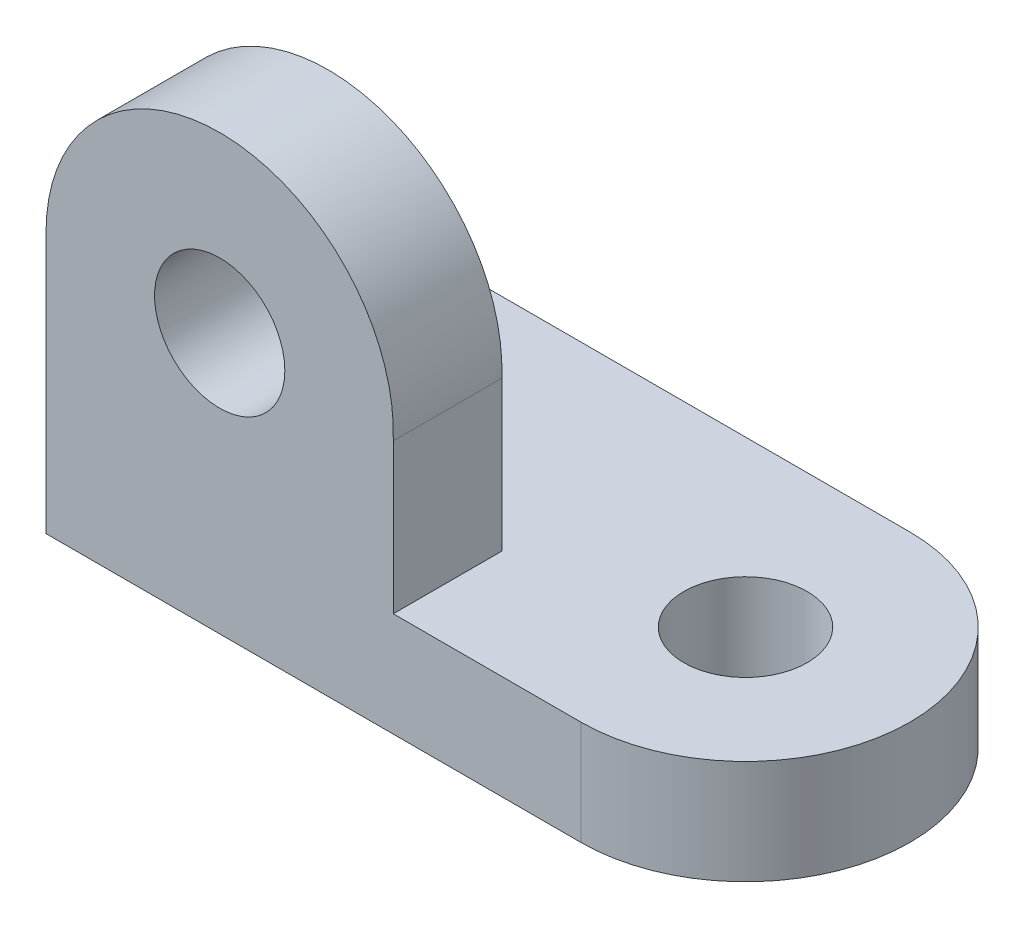
ISO-10303-21;
HEADER;
FILE_DESCRIPTION(('STEP AP214'),'2;1');
FILE_NAME('part.step','',(''),(''),'','','');
FILE_SCHEMA(('AUTOMOTIVE_DESIGN { 1 0 10303 214 1 1 1 1 }'));
ENDSEC;
DATA;
#1=APPLICATION_CONTEXT('core data for automotive mechanical design processes');
#2=APPLICATION_PROTOCOL_DEFINITION('international standard','automotive_design',2000,#1);
#3=PRODUCT_CONTEXT('',#1,'mechanical');
#4=PRODUCT('Part','Part','',(#3));
#5=PRODUCT_RELATED_PRODUCT_CATEGORY('part','',(#4));
#6=PRODUCT_DEFINITION_FORMATION('','',#4);
#7=PRODUCT_DEFINITION_CONTEXT('part definition',#1,'design');
#8=PRODUCT_DEFINITION('design','',#6,#7);
#9=PRODUCT_DEFINITION_SHAPE('','',#8);
#10=(LENGTH_UNIT() NAMED_UNIT(*) SI_UNIT(.MILLI.,.METRE.));
#11=(NAMED_UNIT(*) PLANE_ANGLE_UNIT() SI_UNIT($,.RADIAN.));
#12=(NAMED_UNIT(*) SI_UNIT($,.STERADIAN.) SOLID_ANGLE_UNIT());
#13=UNCERTAINTY_MEASURE_WITH_UNIT(LENGTH_MEASURE(1.E-05),#10,'distance_accuracy_value','');
#14=(GEOMETRIC_REPRESENTATION_CONTEXT(3) GLOBAL_UNCERTAINTY_ASSIGNED_CONTEXT((#13)) GLOBAL_UNIT_ASSIGNED_CONTEXT((#10,
#11,#12)) REPRESENTATION_CONTEXT('',''));
#15=CARTESIAN_POINT('',(0.,0.,0.));
#16=DIRECTION('',(0.,0.,1.));
#17=DIRECTION('',(1.,0.,0.));
#18=AXIS2_PLACEMENT_3D('',#15,#16,#17);
#19=CARTESIAN_POINT('',(123.179963090235,24.,-37.9015271046878));
#20=DIRECTION('',(0.,1.,0.));
#21=DIRECTION('',(0.,0.,1.));
#22=AXIS2_PLACEMENT_3D('',#19,#20,#21);
#23=PLANE('',#22);
#24=DIRECTION('',(-1.,0.,0.));
#25=VECTOR('',#24,1.);
#26=CARTESIAN_POINT('',(123.179963090235,24.,-75.8030542093757));
#27=LINE('',#26,#25);
#28=CARTESIAN_POINT('',(123.179963090235,24.,-75.8030542093757));
#29=VERTEX_POINT('',#28);
#30=CARTESIAN_POINT('',(20.,24.,-75.8030542093757));
#31=VERTEX_POINT('',#30);
#32=EDGE_CURVE('E159',#29,#31,#27,.T.);
#33=ORIENTED_EDGE('',*,*,#32,.T.);
#34=CARTESIAN_POINT('',(20.,24.,-55.8030542093757));
#35=DIRECTION('',(0.,1.,0.));
#36=DIRECTION('',(0.,0.,1.));
#37=AXIS2_PLACEMENT_3D('',#34,#35,#36);
#38=CIRCLE('',#37,20.);
#39=CARTESIAN_POINT('',(0.,24.,-55.8030542093757));
#40=VERTEX_POINT('',#39);
#41=EDGE_CURVE('E11',#31,#40,#38,.T.);
#42=ORIENTED_EDGE('',*,*,#41,.T.);
#43=DIRECTION('',(0.,0.,1.));
#44=VECTOR('',#43,1.);
#45=CARTESIAN_POINT('',(0.,24.,0.));
#46=LINE('',#45,#44);
#47=CARTESIAN_POINT('',(0.,24.,-25.));
#48=VERTEX_POINT('',#47);
#49=EDGE_CURVE('E161',#40,#48,#46,.T.);
#50=ORIENTED_EDGE('',*,*,#49,.T.);
#51=DIRECTION('',(-1.,0.,0.));
#52=VECTOR('',#51,1.);
#53=CARTESIAN_POINT('',(0.,24.,-25.));
#54=LINE('',#53,#52);
#55=CARTESIAN_POINT('',(79.9713533622832,24.,-25.));
#56=VERTEX_POINT('',#55);
#57=EDGE_CURVE('E112',#56,#48,#54,.T.);
#58=ORIENTED_EDGE('',*,*,#57,.F.);
#59=DIRECTION('',(0.,0.,1.));
#60=VECTOR('',#59,1.);
#61=CARTESIAN_POINT('',(79.9713533622832,24.,-25.));
#62=LINE('',#61,#60);
#63=CARTESIAN_POINT('',(79.9713533622832,24.,0.));
#64=VERTEX_POINT('',#63);
#65=EDGE_CURVE('E124',#56,#64,#62,.T.);
#66=ORIENTED_EDGE('',*,*,#65,.T.);
#67=DIRECTION('',(1.,0.,0.));
#68=VECTOR('',#67,1.);
#69=CARTESIAN_POINT('',(0.,24.,0.));
#70=LINE('',#69,#68);
#71=CARTESIAN_POINT('',(123.179963090235,24.,0.));
#72=VERTEX_POINT('',#71);
#73=EDGE_CURVE('E154',#64,#72,#70,.T.);
#74=ORIENTED_EDGE('',*,*,#73,.T.);
#75=CARTESIAN_POINT('',(123.179963090235,24.,-37.9015271046878));
#76=DIRECTION('',(0.,1.,0.));
#77=DIRECTION('',(0.,0.,1.));
#78=AXIS2_PLACEMENT_3D('',#75,#76,#77);
#79=CIRCLE('',#78,37.9015271046878);
#80=EDGE_CURVE('E156',#72,#29,#79,.T.);
#81=ORIENTED_EDGE('',*,*,#80,.T.);
#82=EDGE_LOOP('',(#33,#42,#50,#58,#66,#74,#81));
#83=FACE_BOUND('',#82,.T.);
#84=CARTESIAN_POINT('',(123.179963090235,24.,-37.9015271046878));
#85=DIRECTION('',(0.,1.,0.));
#86=DIRECTION('',(0.,0.,1.));
#87=AXIS2_PLACEMENT_3D('',#84,#85,#86);
#88=CIRCLE('',#87,14.213072664258);
#89=CARTESIAN_POINT('',(123.179963090235,24.,-23.6884544404299));
#90=VERTEX_POINT('',#89);
#91=EDGE_CURVE('E148',#90,#90,#88,.T.);
#92=ORIENTED_EDGE('',*,*,#91,.F.);
#93=EDGE_LOOP('',(#92));
#94=FACE_BOUND('',#93,.T.);
#95=ADVANCED_FACE('F39',(#83,#94),#23,.T.);
#96=CARTESIAN_POINT('',(123.179963090235,0.,-37.9015271046878));
#97=DIRECTION('',(0.,1.,0.));
#98=DIRECTION('',(0.,0.,1.));
#99=AXIS2_PLACEMENT_3D('',#96,#97,#98);
#100=PLANE('',#99);
#101=DIRECTION('',(0.,0.,1.));
#102=VECTOR('',#101,1.);
#103=CARTESIAN_POINT('',(0.,0.,0.));
#104=LINE('',#103,#102);
#105=CARTESIAN_POINT('',(0.,0.,-55.8030542093757));
#106=VERTEX_POINT('',#105);
#107=CARTESIAN_POINT('',(0.,0.,0.));
#108=VERTEX_POINT('',#107);
#109=EDGE_CURVE('E157',#106,#108,#104,.T.);
#110=ORIENTED_EDGE('',*,*,#109,.F.);
#111=CARTESIAN_POINT('',(20.,0.,-55.8030542093757));
#112=DIRECTION('',(0.,1.,0.));
#113=DIRECTION('',(0.,0.,1.));
#114=AXIS2_PLACEMENT_3D('',#111,#112,#113);
#115=CIRCLE('',#114,20.);
#116=CARTESIAN_POINT('',(20.,0.,-75.8030542093757));
#117=VERTEX_POINT('',#116);
#118=EDGE_CURVE('E61',#106,#117,#115,.F.);
#119=ORIENTED_EDGE('',*,*,#118,.T.);
#120=DIRECTION('',(-1.,0.,0.));
#121=VECTOR('',#120,1.);
#122=CARTESIAN_POINT('',(123.179963090235,0.,-75.8030542093757));
#123=LINE('',#122,#121);
#124=CARTESIAN_POINT('',(123.179963090235,0.,-75.8030542093757));
#125=VERTEX_POINT('',#124);
#126=EDGE_CURVE('E167',#125,#117,#123,.T.);
#127=ORIENTED_EDGE('',*,*,#126,.F.);
#128=CARTESIAN_POINT('',(123.179963090235,0.,-37.9015271046878));
#129=DIRECTION('',(0.,1.,0.));
#130=DIRECTION('',(0.,0.,1.));
#131=AXIS2_PLACEMENT_3D('',#128,#129,#130);
#132=CIRCLE('',#131,37.9015271046878);
#133=CARTESIAN_POINT('',(123.179963090235,0.,0.));
#134=VERTEX_POINT('',#133);
#135=EDGE_CURVE('E165',#134,#125,#132,.T.);
#136=ORIENTED_EDGE('',*,*,#135,.F.);
#137=DIRECTION('',(1.,0.,0.));
#138=VECTOR('',#137,1.);
#139=CARTESIAN_POINT('',(0.,0.,0.));
#140=LINE('',#139,#138);
#141=EDGE_CURVE('E151',#108,#134,#140,.T.);
#142=ORIENTED_EDGE('',*,*,#141,.F.);
#143=EDGE_LOOP('',(#110,#119,#127,#136,#142));
#144=FACE_BOUND('',#143,.T.);
#145=CARTESIAN_POINT('',(123.179963090235,0.,-37.9015271046878));
#146=DIRECTION('',(0.,1.,0.));
#147=DIRECTION('',(0.,0.,1.));
#148=AXIS2_PLACEMENT_3D('',#145,#146,#147);
#149=CIRCLE('',#148,14.213072664258);
#150=CARTESIAN_POINT('',(123.179963090235,0.,-23.6884544404299));
#151=VERTEX_POINT('',#150);
#152=EDGE_CURVE('E145',#151,#151,#149,.T.);
#153=ORIENTED_EDGE('',*,*,#152,.T.);
#154=EDGE_LOOP('',(#153));
#155=FACE_BOUND('',#154,.T.);
#156=ADVANCED_FACE('F184',(#144,#155),#100,.F.);
#157=CARTESIAN_POINT('',(0.,24.,0.));
#158=DIRECTION('',(0.,0.,-1.));
#159=DIRECTION('',(-1.,0.,0.));
#160=AXIS2_PLACEMENT_3D('',#157,#158,#159);
#161=PLANE('',#160);
#162=ORIENTED_EDGE('',*,*,#141,.T.);
#163=DIRECTION('',(0.,-1.,0.));
#164=VECTOR('',#163,1.);
#165=CARTESIAN_POINT('',(123.179963090235,24.,0.));
#166=LINE('',#165,#164);
#167=EDGE_CURVE('E174',#72,#134,#166,.T.);
#168=ORIENTED_EDGE('',*,*,#167,.F.);
#169=ORIENTED_EDGE('',*,*,#73,.F.);
#170=DIRECTION('',(0.,-1.,0.));
#171=VECTOR('',#170,1.);
#172=CARTESIAN_POINT('',(79.9713533622832,0.,0.));
#173=LINE('',#172,#171);
#174=CARTESIAN_POINT('',(79.9713533622832,58.4864246343528,0.));
#175=VERTEX_POINT('',#174);
#176=EDGE_CURVE('E133',#175,#64,#173,.T.);
#177=ORIENTED_EDGE('',*,*,#176,.F.);
#178=CARTESIAN_POINT('',(40.,60.,0.));
#179=DIRECTION('',(0.,0.,1.));
#180=DIRECTION('',(1.,0.,0.));
#181=AXIS2_PLACEMENT_3D('',#178,#179,#180);
#182=CIRCLE('',#181,40.);
#183=CARTESIAN_POINT('',(0.,60.,0.));
#184=VERTEX_POINT('',#183);
#185=EDGE_CURVE('E141',#184,#175,#182,.F.);
#186=ORIENTED_EDGE('',*,*,#185,.F.);
#187=DIRECTION('',(0.,-1.,0.));
#188=VECTOR('',#187,1.);
#189=CARTESIAN_POINT('',(0.,24.,0.));
#190=LINE('',#189,#188);
#191=EDGE_CURVE('E120',#184,#108,#190,.T.);
#192=ORIENTED_EDGE('',*,*,#191,.T.);
#193=EDGE_LOOP('',(#162,#168,#169,#177,#186,#192));
#194=FACE_BOUND('',#193,.T.);
#195=CARTESIAN_POINT('',(40.,60.,0.));
#196=DIRECTION('',(0.,0.,1.));
#197=DIRECTION('',(1.,0.,0.));
#198=AXIS2_PLACEMENT_3D('',#195,#196,#197);
#199=CIRCLE('',#198,15.);
#200=CARTESIAN_POINT('',(55.,60.,0.));
#201=VERTEX_POINT('',#200);
#202=EDGE_CURVE('E138',#201,#201,#199,.T.);
#203=ORIENTED_EDGE('',*,*,#202,.F.);
#204=EDGE_LOOP('',(#203));
#205=FACE_BOUND('',#204,.T.);
#206=ADVANCED_FACE('F188',(#194,#205),#161,.F.);
#207=CARTESIAN_POINT('',(123.179963090235,24.,-37.9015271046878));
#208=DIRECTION('',(0.,-1.,0.));
#209=DIRECTION('',(0.,0.,-1.));
#210=AXIS2_PLACEMENT_3D('',#207,#208,#209);
#211=CYLINDRICAL_SURFACE('',#210,37.9015271046878);
#212=ORIENTED_EDGE('',*,*,#135,.T.);
#213=DIRECTION('',(0.,-1.,0.));
#214=VECTOR('',#213,1.);
#215=CARTESIAN_POINT('',(123.179963090235,24.,-75.8030542093757));
#216=LINE('',#215,#214);
#217=EDGE_CURVE('E171',#29,#125,#216,.T.);
#218=ORIENTED_EDGE('',*,*,#217,.F.);
#219=ORIENTED_EDGE('',*,*,#80,.F.);
#220=ORIENTED_EDGE('',*,*,#167,.T.);
#221=EDGE_LOOP('',(#212,#218,#219,#220));
#222=FACE_BOUND('',#221,.T.);
#223=ADVANCED_FACE('F218',(#222),#211,.T.);
#224=CARTESIAN_POINT('',(123.179963090235,24.,-75.8030542093757));
#225=DIRECTION('',(0.,0.,1.));
#226=DIRECTION('',(1.,0.,0.));
#227=AXIS2_PLACEMENT_3D('',#224,#225,#226);
#228=PLANE('',#227);
#229=ORIENTED_EDGE('',*,*,#126,.T.);
#230=DIRECTION('',(0.,-1.,0.));
#231=VECTOR('',#230,1.);
#232=CARTESIAN_POINT('',(20.,24.,-75.8030542093757));
#233=LINE('',#232,#231);
#234=EDGE_CURVE('E47',#117,#31,#233,.F.);
#235=ORIENTED_EDGE('',*,*,#234,.T.);
#236=ORIENTED_EDGE('',*,*,#32,.F.);
#237=ORIENTED_EDGE('',*,*,#217,.T.);
#238=EDGE_LOOP('',(#229,#235,#236,#237));
#239=FACE_BOUND('',#238,.T.);
#240=ADVANCED_FACE('F215',(#239),#228,.F.);
#241=CARTESIAN_POINT('',(0.,24.,0.));
#242=DIRECTION('',(1.,0.,0.));
#243=DIRECTION('',(0.,0.,-1.));
#244=AXIS2_PLACEMENT_3D('',#241,#242,#243);
#245=PLANE('',#244);
#246=ORIENTED_EDGE('',*,*,#49,.F.);
#247=DIRECTION('',(0.,-1.,0.));
#248=VECTOR('',#247,1.);
#249=CARTESIAN_POINT('',(0.,24.,-55.8030542093757));
#250=LINE('',#249,#248);
#251=EDGE_CURVE('E177',#40,#106,#250,.T.);
#252=ORIENTED_EDGE('',*,*,#251,.T.);
#253=ORIENTED_EDGE('',*,*,#109,.T.);
#254=ORIENTED_EDGE('',*,*,#191,.F.);
#255=DIRECTION('',(0.,0.,1.));
#256=VECTOR('',#255,1.);
#257=CARTESIAN_POINT('',(0.,60.,-25.));
#258=LINE('',#257,#256);
#259=CARTESIAN_POINT('',(0.,60.,-25.));
#260=VERTEX_POINT('',#259);
#261=EDGE_CURVE('E117',#260,#184,#258,.T.);
#262=ORIENTED_EDGE('',*,*,#261,.F.);
#263=DIRECTION('',(0.,1.,0.));
#264=VECTOR('',#263,1.);
#265=CARTESIAN_POINT('',(0.,0.,-25.));
#266=LINE('',#265,#264);
#267=EDGE_CURVE('E105',#48,#260,#266,.T.);
#268=ORIENTED_EDGE('',*,*,#267,.F.);
#269=EDGE_LOOP('',(#246,#252,#253,#254,#262,#268));
#270=FACE_BOUND('',#269,.T.);
#271=ADVANCED_FACE('F118',(#270),#245,.F.);
#272=CARTESIAN_POINT('',(123.179963090235,24.,-37.9015271046878));
#273=DIRECTION('',(0.,-1.,0.));
#274=DIRECTION('',(0.,0.,-1.));
#275=AXIS2_PLACEMENT_3D('',#272,#273,#274);
#276=CYLINDRICAL_SURFACE('',#275,14.213072664258);
#277=ORIENTED_EDGE('',*,*,#91,.T.);
#278=EDGE_LOOP('',(#277));
#279=FACE_BOUND('',#278,.T.);
#280=ORIENTED_EDGE('',*,*,#152,.F.);
#281=EDGE_LOOP('',(#280));
#282=FACE_BOUND('',#281,.T.);
#283=ADVANCED_FACE('F211',(#279,#282),#276,.F.);
#284=CARTESIAN_POINT('',(40.,60.,-25.));
#285=DIRECTION('',(0.,0.,1.));
#286=DIRECTION('',(1.,0.,0.));
#287=AXIS2_PLACEMENT_3D('',#284,#285,#286);
#288=CYLINDRICAL_SURFACE('',#287,40.);
#289=ORIENTED_EDGE('',*,*,#185,.T.);
#290=DIRECTION('',(0.,0.,1.));
#291=VECTOR('',#290,1.);
#292=CARTESIAN_POINT('',(79.9713533622832,58.4864246343528,-25.));
#293=LINE('',#292,#291);
#294=CARTESIAN_POINT('',(79.9713533622832,58.4864246343528,-25.));
#295=VERTEX_POINT('',#294);
#296=EDGE_CURVE('E129',#295,#175,#293,.T.);
#297=ORIENTED_EDGE('',*,*,#296,.F.);
#298=CARTESIAN_POINT('',(40.,60.,-25.));
#299=DIRECTION('',(0.,0.,1.));
#300=DIRECTION('',(1.,0.,0.));
#301=AXIS2_PLACEMENT_3D('',#298,#299,#300);
#302=CIRCLE('',#301,40.);
#303=EDGE_CURVE('E109',#260,#295,#302,.F.);
#304=ORIENTED_EDGE('',*,*,#303,.F.);
#305=ORIENTED_EDGE('',*,*,#261,.T.);
#306=EDGE_LOOP('',(#289,#297,#304,#305));
#307=FACE_BOUND('',#306,.T.);
#308=ADVANCED_FACE('F127',(#307),#288,.T.);
#309=CARTESIAN_POINT('',(79.9713533622832,0.,-25.));
#310=DIRECTION('',(-1.,0.,0.));
#311=DIRECTION('',(0.,0.,1.));
#312=AXIS2_PLACEMENT_3D('',#309,#310,#311);
#313=PLANE('',#312);
#314=ORIENTED_EDGE('',*,*,#176,.T.);
#315=ORIENTED_EDGE('',*,*,#65,.F.);
#316=DIRECTION('',(0.,-1.,0.));
#317=VECTOR('',#316,1.);
#318=CARTESIAN_POINT('',(79.9713533622832,0.,-25.));
#319=LINE('',#318,#317);
#320=EDGE_CURVE('E125',#295,#56,#319,.T.);
#321=ORIENTED_EDGE('',*,*,#320,.F.);
#322=ORIENTED_EDGE('',*,*,#296,.T.);
#323=EDGE_LOOP('',(#314,#315,#321,#322));
#324=FACE_BOUND('',#323,.T.);
#325=ADVANCED_FACE('F193',(#324),#313,.F.);
#326=CARTESIAN_POINT('',(40.,60.,-25.));
#327=DIRECTION('',(0.,0.,1.));
#328=DIRECTION('',(1.,0.,0.));
#329=AXIS2_PLACEMENT_3D('',#326,#327,#328);
#330=CYLINDRICAL_SURFACE('',#329,15.);
#331=CARTESIAN_POINT('',(40.,60.,-25.));
#332=DIRECTION('',(0.,0.,1.));
#333=DIRECTION('',(1.,0.,0.));
#334=AXIS2_PLACEMENT_3D('',#331,#332,#333);
#335=CIRCLE('',#334,15.);
#336=CARTESIAN_POINT('',(55.,60.,-25.));
#337=VERTEX_POINT('',#336);
#338=EDGE_CURVE('E130',#337,#337,#335,.T.);
#339=ORIENTED_EDGE('',*,*,#338,.F.);
#340=EDGE_LOOP('',(#339));
#341=FACE_BOUND('',#340,.T.);
#342=ORIENTED_EDGE('',*,*,#202,.T.);
#343=EDGE_LOOP('',(#342));
#344=FACE_BOUND('',#343,.T.);
#345=ADVANCED_FACE('F201',(#341,#344),#330,.F.);
#346=CARTESIAN_POINT('',(0.,0.,-25.));
#347=DIRECTION('',(0.,0.,1.));
#348=DIRECTION('',(1.,0.,0.));
#349=AXIS2_PLACEMENT_3D('',#346,#347,#348);
#350=PLANE('',#349);
#351=ORIENTED_EDGE('',*,*,#338,.T.);
#352=EDGE_LOOP('',(#351));
#353=FACE_BOUND('',#352,.T.);
#354=ORIENTED_EDGE('',*,*,#303,.T.);
#355=ORIENTED_EDGE('',*,*,#320,.T.);
#356=ORIENTED_EDGE('',*,*,#57,.T.);
#357=ORIENTED_EDGE('',*,*,#267,.T.);
#358=EDGE_LOOP('',(#354,#355,#356,#357));
#359=FACE_BOUND('',#358,.T.);
#360=ADVANCED_FACE('F107',(#353,#359),#350,.F.);
#361=CARTESIAN_POINT('',(20.,24.,-55.8030542093757));
#362=DIRECTION('',(0.,-1.,0.));
#363=DIRECTION('',(0.,0.,-1.));
#364=AXIS2_PLACEMENT_3D('',#361,#362,#363);
#365=CYLINDRICAL_SURFACE('',#364,20.);
#366=ORIENTED_EDGE('',*,*,#41,.F.);
#367=ORIENTED_EDGE('',*,*,#234,.F.);
#368=ORIENTED_EDGE('',*,*,#118,.F.);
#369=ORIENTED_EDGE('',*,*,#251,.F.);
#370=EDGE_LOOP('',(#366,#367,#368,#369));
#371=FACE_BOUND('',#370,.T.);
#372=ADVANCED_FACE('F41',(#371),#365,.T.);
#373=CLOSED_SHELL('',(#95,#156,#206,#223,#240,#271,#283,#308,#325,#345,#360,#372));
#374=MANIFOLD_SOLID_BREP('B2',#373);
#375=ADVANCED_BREP_SHAPE_REPRESENTATION('',(#18,#374),#14);
#376=SHAPE_DEFINITION_REPRESENTATION(#9,#375);
ENDSEC;
END-ISO-10303-21;
